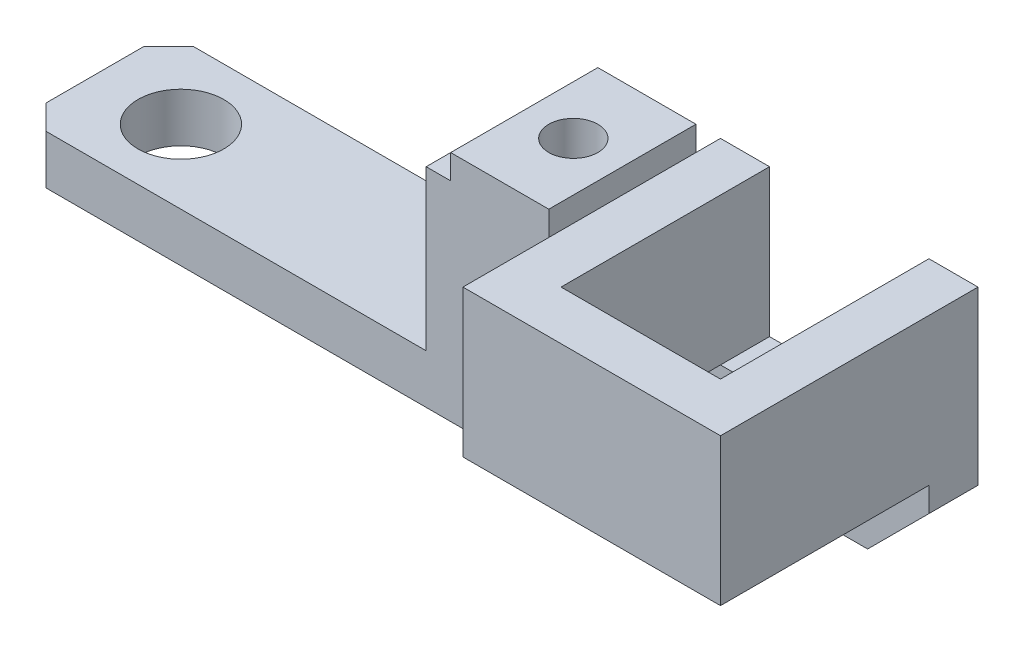
ISO-10303-21;
HEADER;
FILE_DESCRIPTION(('STEP AP214'),'2;1');
FILE_NAME('part.step','',(''),(''),'','','');
FILE_SCHEMA(('AUTOMOTIVE_DESIGN { 1 0 10303 214 1 1 1 1 }'));
ENDSEC;
DATA;
#1=APPLICATION_CONTEXT('core data for automotive mechanical design processes');
#2=APPLICATION_PROTOCOL_DEFINITION('international standard','automotive_design',2000,#1);
#3=PRODUCT_CONTEXT('',#1,'mechanical');
#4=PRODUCT('Part','Part','',(#3));
#5=PRODUCT_RELATED_PRODUCT_CATEGORY('part','',(#4));
#6=PRODUCT_DEFINITION_FORMATION('','',#4);
#7=PRODUCT_DEFINITION_CONTEXT('part definition',#1,'design');
#8=PRODUCT_DEFINITION('design','',#6,#7);
#9=PRODUCT_DEFINITION_SHAPE('','',#8);
#10=(LENGTH_UNIT() NAMED_UNIT(*) SI_UNIT(.MILLI.,.METRE.));
#11=(NAMED_UNIT(*) PLANE_ANGLE_UNIT() SI_UNIT($,.RADIAN.));
#12=(NAMED_UNIT(*) SI_UNIT($,.STERADIAN.) SOLID_ANGLE_UNIT());
#13=UNCERTAINTY_MEASURE_WITH_UNIT(LENGTH_MEASURE(1.E-05),#10,'distance_accuracy_value','');
#14=(GEOMETRIC_REPRESENTATION_CONTEXT(3) GLOBAL_UNCERTAINTY_ASSIGNED_CONTEXT((#13)) GLOBAL_UNIT_ASSIGNED_CONTEXT((#10,
#11,#12)) REPRESENTATION_CONTEXT('',''));
#15=CARTESIAN_POINT('',(0.,0.,0.));
#16=DIRECTION('',(0.,0.,1.));
#17=DIRECTION('',(1.,0.,0.));
#18=AXIS2_PLACEMENT_3D('',#15,#16,#17);
#19=CARTESIAN_POINT('',(0.,19.,0.));
#20=DIRECTION('',(0.,-1.,0.));
#21=DIRECTION('',(0.,0.,-1.));
#22=AXIS2_PLACEMENT_3D('',#19,#20,#21);
#23=PLANE('',#22);
#24=DIRECTION('',(-1.,0.,0.));
#25=VECTOR('',#24,1.);
#26=CARTESIAN_POINT('',(28.5,19.,-6.));
#27=LINE('',#26,#25);
#28=CARTESIAN_POINT('',(26.5,19.,-6.));
#29=VERTEX_POINT('',#28);
#30=CARTESIAN_POINT('',(18.5,19.,-6.));
#31=VERTEX_POINT('',#30);
#32=EDGE_CURVE('E290',#29,#31,#27,.T.);
#33=ORIENTED_EDGE('',*,*,#32,.T.);
#34=DIRECTION('',(0.,0.,1.));
#35=VECTOR('',#34,1.);
#36=CARTESIAN_POINT('',(18.5,19.,0.));
#37=LINE('',#36,#35);
#38=CARTESIAN_POINT('',(18.5,19.,6.));
#39=VERTEX_POINT('',#38);
#40=EDGE_CURVE('E267',#31,#39,#37,.T.);
#41=ORIENTED_EDGE('',*,*,#40,.T.);
#42=DIRECTION('',(-1.,0.,0.));
#43=VECTOR('',#42,1.);
#44=CARTESIAN_POINT('',(28.5,19.,6.));
#45=LINE('',#44,#43);
#46=CARTESIAN_POINT('',(26.5,19.,6.));
#47=VERTEX_POINT('',#46);
#48=EDGE_CURVE('E311',#47,#39,#45,.T.);
#49=ORIENTED_EDGE('',*,*,#48,.F.);
#50=DIRECTION('',(0.,0.,1.));
#51=VECTOR('',#50,1.);
#52=CARTESIAN_POINT('',(26.5,19.,0.));
#53=LINE('',#52,#51);
#54=EDGE_CURVE('E246',#29,#47,#53,.T.);
#55=ORIENTED_EDGE('',*,*,#54,.F.);
#56=EDGE_LOOP('',(#33,#41,#49,#55));
#57=FACE_BOUND('',#56,.T.);
#58=CARTESIAN_POINT('',(22.5,19.000012,0.));
#59=DIRECTION('',(0.,1.,0.));
#60=DIRECTION('',(0.,0.,1.));
#61=AXIS2_PLACEMENT_3D('',#58,#59,#60);
#62=CIRCLE('',#61,2.);
#63=CARTESIAN_POINT('',(22.5,19.000012,2.));
#64=VERTEX_POINT('',#63);
#65=EDGE_CURVE('E364',#64,#64,#62,.T.);
#66=ORIENTED_EDGE('',*,*,#65,.F.);
#67=EDGE_LOOP('',(#66));
#68=FACE_BOUND('',#67,.T.);
#69=ADVANCED_FACE('F51',(#57,#68),#23,.F.);
#70=CARTESIAN_POINT('',(28.5,19.,15.));
#71=DIRECTION('',(-1.,0.,0.));
#72=DIRECTION('',(0.,0.,1.));
#73=AXIS2_PLACEMENT_3D('',#70,#71,#72);
#74=PLANE('',#73);
#75=DIRECTION('',(0.,-1.,0.));
#76=VECTOR('',#75,1.);
#77=CARTESIAN_POINT('',(28.5,19.,6.));
#78=LINE('',#77,#76);
#79=CARTESIAN_POINT('',(28.5,17.,6.));
#80=VERTEX_POINT('',#79);
#81=CARTESIAN_POINT('',(28.5,7.,6.));
#82=VERTEX_POINT('',#81);
#83=EDGE_CURVE('E237',#80,#82,#78,.T.);
#84=ORIENTED_EDGE('',*,*,#83,.T.);
#85=DIRECTION('',(0.,0.,1.));
#86=VECTOR('',#85,1.);
#87=CARTESIAN_POINT('',(28.5,7.,-24.1359436211787));
#88=LINE('',#87,#86);
#89=CARTESIAN_POINT('',(28.5,7.,15.));
#90=VERTEX_POINT('',#89);
#91=EDGE_CURVE('E220',#82,#90,#88,.T.);
#92=ORIENTED_EDGE('',*,*,#91,.T.);
#93=DIRECTION('',(0.,-1.,0.));
#94=VECTOR('',#93,1.);
#95=CARTESIAN_POINT('',(28.5,19.,15.));
#96=LINE('',#95,#94);
#97=CARTESIAN_POINT('',(28.5,19.,15.));
#98=VERTEX_POINT('',#97);
#99=EDGE_CURVE('E235',#98,#90,#96,.T.);
#100=ORIENTED_EDGE('',*,*,#99,.F.);
#101=DIRECTION('',(0.,0.,-1.));
#102=VECTOR('',#101,1.);
#103=CARTESIAN_POINT('',(28.5,19.,15.));
#104=LINE('',#103,#102);
#105=CARTESIAN_POINT('',(28.5,19.,-6.));
#106=VERTEX_POINT('',#105);
#107=EDGE_CURVE('E519',#98,#106,#104,.T.);
#108=ORIENTED_EDGE('',*,*,#107,.T.);
#109=DIRECTION('',(0.,-1.,0.));
#110=VECTOR('',#109,1.);
#111=CARTESIAN_POINT('',(28.5,19.,-6.));
#112=LINE('',#111,#110);
#113=CARTESIAN_POINT('',(28.5,17.,-6.));
#114=VERTEX_POINT('',#113);
#115=EDGE_CURVE('E261',#106,#114,#112,.T.);
#116=ORIENTED_EDGE('',*,*,#115,.T.);
#117=DIRECTION('',(0.,0.,-1.));
#118=VECTOR('',#117,1.);
#119=CARTESIAN_POINT('',(28.5,17.,0.));
#120=LINE('',#119,#118);
#121=EDGE_CURVE('E301',#80,#114,#120,.T.);
#122=ORIENTED_EDGE('',*,*,#121,.F.);
#123=EDGE_LOOP('',(#84,#92,#100,#108,#116,#122));
#124=FACE_BOUND('',#123,.T.);
#125=ADVANCED_FACE('F226',(#124),#74,.T.);
#126=CARTESIAN_POINT('',(0.,4.,-6.));
#127=DIRECTION('',(0.,0.,-1.));
#128=DIRECTION('',(-1.,0.,0.));
#129=AXIS2_PLACEMENT_3D('',#126,#127,#128);
#130=PLANE('',#129);
#131=DIRECTION('',(1.,0.,0.));
#132=VECTOR('',#131,1.);
#133=CARTESIAN_POINT('',(0.,0.,-6.));
#134=LINE('',#133,#132);
#135=CARTESIAN_POINT('',(-14.5,0.,-6.));
#136=VERTEX_POINT('',#135);
#137=CARTESIAN_POINT('',(44.5,0.,-6.));
#138=VERTEX_POINT('',#137);
#139=EDGE_CURVE('E350',#136,#138,#134,.T.);
#140=ORIENTED_EDGE('',*,*,#139,.F.);
#141=DIRECTION('',(0.,1.,0.));
#142=VECTOR('',#141,1.);
#143=CARTESIAN_POINT('',(-14.5,4.,-6.));
#144=LINE('',#143,#142);
#145=CARTESIAN_POINT('',(-14.5,4.,-6.));
#146=VERTEX_POINT('',#145);
#147=EDGE_CURVE('E78',#136,#146,#144,.T.);
#148=ORIENTED_EDGE('',*,*,#147,.T.);
#149=DIRECTION('',(1.,0.,0.));
#150=VECTOR('',#149,1.);
#151=CARTESIAN_POINT('',(0.,4.,-6.));
#152=LINE('',#151,#150);
#153=CARTESIAN_POINT('',(16.5,4.,-6.));
#154=VERTEX_POINT('',#153);
#155=EDGE_CURVE('E339',#146,#154,#152,.T.);
#156=ORIENTED_EDGE('',*,*,#155,.T.);
#157=DIRECTION('',(0.,-1.,0.));
#158=VECTOR('',#157,1.);
#159=CARTESIAN_POINT('',(16.5,19.,-6.));
#160=LINE('',#159,#158);
#161=CARTESIAN_POINT('',(16.5,17.,-6.));
#162=VERTEX_POINT('',#161);
#163=EDGE_CURVE('E322',#162,#154,#160,.T.);
#164=ORIENTED_EDGE('',*,*,#163,.F.);
#165=DIRECTION('',(-1.,0.,0.));
#166=VECTOR('',#165,1.);
#167=CARTESIAN_POINT('',(0.,17.,-6.));
#168=LINE('',#167,#166);
#169=CARTESIAN_POINT('',(18.5,17.,-6.));
#170=VERTEX_POINT('',#169);
#171=EDGE_CURVE('E268',#170,#162,#168,.T.);
#172=ORIENTED_EDGE('',*,*,#171,.F.);
#173=DIRECTION('',(0.,1.,0.));
#174=VECTOR('',#173,1.);
#175=CARTESIAN_POINT('',(18.5,17.,-6.));
#176=LINE('',#175,#174);
#177=EDGE_CURVE('E276',#170,#31,#176,.T.);
#178=ORIENTED_EDGE('',*,*,#177,.T.);
#179=ORIENTED_EDGE('',*,*,#32,.F.);
#180=DIRECTION('',(0.,1.,0.));
#181=VECTOR('',#180,1.);
#182=CARTESIAN_POINT('',(26.5,17.,-6.));
#183=LINE('',#182,#181);
#184=CARTESIAN_POINT('',(26.5,17.,-6.));
#185=VERTEX_POINT('',#184);
#186=EDGE_CURVE('E302',#185,#29,#183,.T.);
#187=ORIENTED_EDGE('',*,*,#186,.F.);
#188=DIRECTION('',(-1.,0.,0.));
#189=VECTOR('',#188,1.);
#190=CARTESIAN_POINT('',(0.,17.,-6.));
#191=LINE('',#190,#189);
#192=EDGE_CURVE('E253',#114,#185,#191,.T.);
#193=ORIENTED_EDGE('',*,*,#192,.F.);
#194=ORIENTED_EDGE('',*,*,#115,.F.);
#195=DIRECTION('',(1.,0.,0.));
#196=VECTOR('',#195,1.);
#197=CARTESIAN_POINT('',(49.5,19.,-6.));
#198=LINE('',#197,#196);
#199=CARTESIAN_POINT('',(32.5,19.,-6.));
#200=VERTEX_POINT('',#199);
#201=EDGE_CURVE('E523',#106,#200,#198,.T.);
#202=ORIENTED_EDGE('',*,*,#201,.T.);
#203=DIRECTION('',(0.,1.,0.));
#204=VECTOR('',#203,1.);
#205=CARTESIAN_POINT('',(32.5,-13.6014705087355,-6.));
#206=LINE('',#205,#204);
#207=CARTESIAN_POINT('',(32.5,7.,-6.));
#208=VERTEX_POINT('',#207);
#209=EDGE_CURVE('E471',#208,#200,#206,.T.);
#210=ORIENTED_EDGE('',*,*,#209,.F.);
#211=DIRECTION('',(1.,0.,0.));
#212=VECTOR('',#211,1.);
#213=CARTESIAN_POINT('',(32.5,7.,-6.));
#214=LINE('',#213,#212);
#215=CARTESIAN_POINT('',(45.5,7.,-6.));
#216=VERTEX_POINT('',#215);
#217=EDGE_CURVE('E472',#208,#216,#214,.T.);
#218=ORIENTED_EDGE('',*,*,#217,.T.);
#219=DIRECTION('',(0.,1.,0.));
#220=VECTOR('',#219,1.);
#221=CARTESIAN_POINT('',(45.5,-13.6014705087355,-6.));
#222=LINE('',#221,#220);
#223=CARTESIAN_POINT('',(45.5,19.,-6.));
#224=VERTEX_POINT('',#223);
#225=EDGE_CURVE('E470',#216,#224,#222,.T.);
#226=ORIENTED_EDGE('',*,*,#225,.T.);
#227=CARTESIAN_POINT('',(49.5,19.,-6.));
#228=VERTEX_POINT('',#227);
#229=EDGE_CURVE('E522',#224,#228,#198,.T.);
#230=ORIENTED_EDGE('',*,*,#229,.T.);
#231=DIRECTION('',(0.,-1.,0.));
#232=VECTOR('',#231,1.);
#233=CARTESIAN_POINT('',(49.5,19.,-6.));
#234=LINE('',#233,#232);
#235=CARTESIAN_POINT('',(49.5,5.,-6.));
#236=VERTEX_POINT('',#235);
#237=EDGE_CURVE('E251',#228,#236,#234,.T.);
#238=ORIENTED_EDGE('',*,*,#237,.T.);
#239=DIRECTION('',(-0.707106781186547,-0.707106781186547,0.));
#240=VECTOR('',#239,1.);
#241=CARTESIAN_POINT('',(49.5,5.,-6.));
#242=LINE('',#241,#240);
#243=EDGE_CURVE('E510',#236,#138,#242,.T.);
#244=ORIENTED_EDGE('',*,*,#243,.T.);
#245=EDGE_LOOP('',(#140,#148,#156,#164,#172,#178,#179,#187,#193,#194,#202,#210,#218,#226,#230,
#238,#244));
#246=FACE_BOUND('',#245,.T.);
#247=ADVANCED_FACE('F399',(#246),#130,.T.);
#248=CARTESIAN_POINT('',(0.,4.,6.));
#249=DIRECTION('',(0.,0.,-1.));
#250=DIRECTION('',(-1.,0.,0.));
#251=AXIS2_PLACEMENT_3D('',#248,#249,#250);
#252=PLANE('',#251);
#253=DIRECTION('',(1.,0.,0.));
#254=VECTOR('',#253,1.);
#255=CARTESIAN_POINT('',(0.,4.,6.));
#256=LINE('',#255,#254);
#257=CARTESIAN_POINT('',(-14.5,4.,6.));
#258=VERTEX_POINT('',#257);
#259=CARTESIAN_POINT('',(16.5,4.,6.));
#260=VERTEX_POINT('',#259);
#261=EDGE_CURVE('E328',#258,#260,#256,.T.);
#262=ORIENTED_EDGE('',*,*,#261,.F.);
#263=DIRECTION('',(0.,-1.,0.));
#264=VECTOR('',#263,1.);
#265=CARTESIAN_POINT('',(-14.5,0.,6.));
#266=LINE('',#265,#264);
#267=CARTESIAN_POINT('',(-14.5,0.,6.));
#268=VERTEX_POINT('',#267);
#269=EDGE_CURVE('E12',#258,#268,#266,.T.);
#270=ORIENTED_EDGE('',*,*,#269,.T.);
#271=DIRECTION('',(1.,0.,0.));
#272=VECTOR('',#271,1.);
#273=CARTESIAN_POINT('',(0.,0.,6.));
#274=LINE('',#273,#272);
#275=CARTESIAN_POINT('',(28.5,0.,6.));
#276=VERTEX_POINT('',#275);
#277=EDGE_CURVE('E327',#268,#276,#274,.T.);
#278=ORIENTED_EDGE('',*,*,#277,.T.);
#279=EDGE_CURVE('E320',#82,#276,#78,.T.);
#280=ORIENTED_EDGE('',*,*,#279,.F.);
#281=ORIENTED_EDGE('',*,*,#83,.F.);
#282=DIRECTION('',(1.,0.,0.));
#283=VECTOR('',#282,1.);
#284=CARTESIAN_POINT('',(0.,17.,6.));
#285=LINE('',#284,#283);
#286=CARTESIAN_POINT('',(26.5,17.,6.));
#287=VERTEX_POINT('',#286);
#288=EDGE_CURVE('E297',#287,#80,#285,.T.);
#289=ORIENTED_EDGE('',*,*,#288,.F.);
#290=DIRECTION('',(0.,1.,0.));
#291=VECTOR('',#290,1.);
#292=CARTESIAN_POINT('',(26.5,17.,6.));
#293=LINE('',#292,#291);
#294=EDGE_CURVE('E282',#287,#47,#293,.T.);
#295=ORIENTED_EDGE('',*,*,#294,.T.);
#296=ORIENTED_EDGE('',*,*,#48,.T.);
#297=DIRECTION('',(0.,1.,0.));
#298=VECTOR('',#297,1.);
#299=CARTESIAN_POINT('',(18.5,17.,6.));
#300=LINE('',#299,#298);
#301=CARTESIAN_POINT('',(18.5,17.,6.));
#302=VERTEX_POINT('',#301);
#303=EDGE_CURVE('E285',#302,#39,#300,.T.);
#304=ORIENTED_EDGE('',*,*,#303,.F.);
#305=DIRECTION('',(1.,0.,0.));
#306=VECTOR('',#305,1.);
#307=CARTESIAN_POINT('',(0.,17.,6.));
#308=LINE('',#307,#306);
#309=CARTESIAN_POINT('',(16.5,17.,6.));
#310=VERTEX_POINT('',#309);
#311=EDGE_CURVE('E274',#310,#302,#308,.T.);
#312=ORIENTED_EDGE('',*,*,#311,.F.);
#313=DIRECTION('',(0.,-1.,0.));
#314=VECTOR('',#313,1.);
#315=CARTESIAN_POINT('',(16.5,19.,6.));
#316=LINE('',#315,#314);
#317=EDGE_CURVE('E319',#310,#260,#316,.T.);
#318=ORIENTED_EDGE('',*,*,#317,.T.);
#319=EDGE_LOOP('',(#262,#270,#278,#280,#281,#289,#295,#296,#304,#312,#318));
#320=FACE_BOUND('',#319,.T.);
#321=ADVANCED_FACE('F397',(#320),#252,.F.);
#322=CARTESIAN_POINT('',(-16.5,4.,0.));
#323=DIRECTION('',(-1.,0.,0.));
#324=DIRECTION('',(0.,0.,1.));
#325=AXIS2_PLACEMENT_3D('',#322,#323,#324);
#326=PLANE('',#325);
#327=DIRECTION('',(0.,0.,-1.));
#328=VECTOR('',#327,1.);
#329=CARTESIAN_POINT('',(-16.5,4.,0.));
#330=LINE('',#329,#328);
#331=CARTESIAN_POINT('',(-16.5,4.,3.99999999999999));
#332=VERTEX_POINT('',#331);
#333=CARTESIAN_POINT('',(-16.5,4.,-3.99999999999999));
#334=VERTEX_POINT('',#333);
#335=EDGE_CURVE('E336',#332,#334,#330,.T.);
#336=ORIENTED_EDGE('',*,*,#335,.T.);
#337=DIRECTION('',(0.,-1.,0.));
#338=VECTOR('',#337,1.);
#339=CARTESIAN_POINT('',(-16.5,4.,-3.99999999999999));
#340=LINE('',#339,#338);
#341=CARTESIAN_POINT('',(-16.5,0.,-3.99999999999999));
#342=VERTEX_POINT('',#341);
#343=EDGE_CURVE('E421',#334,#342,#340,.T.);
#344=ORIENTED_EDGE('',*,*,#343,.T.);
#345=DIRECTION('',(0.,0.,-1.));
#346=VECTOR('',#345,1.);
#347=CARTESIAN_POINT('',(-16.5,0.,0.));
#348=LINE('',#347,#346);
#349=CARTESIAN_POINT('',(-16.5,0.,3.99999999999999));
#350=VERTEX_POINT('',#349);
#351=EDGE_CURVE('E334',#350,#342,#348,.T.);
#352=ORIENTED_EDGE('',*,*,#351,.F.);
#353=DIRECTION('',(0.,1.,0.));
#354=VECTOR('',#353,1.);
#355=CARTESIAN_POINT('',(-16.5,4.,3.99999999999999));
#356=LINE('',#355,#354);
#357=EDGE_CURVE('E359',#350,#332,#356,.T.);
#358=ORIENTED_EDGE('',*,*,#357,.T.);
#359=EDGE_LOOP('',(#336,#344,#352,#358));
#360=FACE_BOUND('',#359,.T.);
#361=ADVANCED_FACE('F393',(#360),#326,.T.);
#362=CARTESIAN_POINT('',(0.,4.,0.));
#363=DIRECTION('',(0.,1.,0.));
#364=DIRECTION('',(0.,0.,1.));
#365=AXIS2_PLACEMENT_3D('',#362,#363,#364);
#366=PLANE('',#365);
#367=CARTESIAN_POINT('',(-9.5,4.,0.));
#368=DIRECTION('',(0.,1.,0.));
#369=DIRECTION('',(0.,0.,1.));
#370=AXIS2_PLACEMENT_3D('',#367,#368,#369);
#371=CIRCLE('',#370,3.5);
#372=CARTESIAN_POINT('',(-9.5,4.,3.5));
#373=VERTEX_POINT('',#372);
#374=EDGE_CURVE('E228',#373,#373,#371,.T.);
#375=ORIENTED_EDGE('',*,*,#374,.F.);
#376=EDGE_LOOP('',(#375));
#377=FACE_BOUND('',#376,.T.);
#378=ORIENTED_EDGE('',*,*,#155,.F.);
#379=DIRECTION('',(0.707106781186549,0.,-0.707106781186546));
#380=VECTOR('',#379,1.);
#381=CARTESIAN_POINT('',(-10.25,4.,-10.25));
#382=LINE('',#381,#380);
#383=EDGE_CURVE('E63',#146,#334,#382,.F.);
#384=ORIENTED_EDGE('',*,*,#383,.T.);
#385=ORIENTED_EDGE('',*,*,#335,.F.);
#386=DIRECTION('',(0.707106781186546,0.,0.707106781186549));
#387=VECTOR('',#386,1.);
#388=CARTESIAN_POINT('',(-10.25,4.,10.25));
#389=LINE('',#388,#387);
#390=EDGE_CURVE('E67',#332,#258,#389,.T.);
#391=ORIENTED_EDGE('',*,*,#390,.T.);
#392=ORIENTED_EDGE('',*,*,#261,.T.);
#393=DIRECTION('',(0.,0.,-1.));
#394=VECTOR('',#393,1.);
#395=CARTESIAN_POINT('',(16.5,4.,0.));
#396=LINE('',#395,#394);
#397=EDGE_CURVE('E335',#260,#154,#396,.T.);
#398=ORIENTED_EDGE('',*,*,#397,.T.);
#399=EDGE_LOOP('',(#378,#384,#385,#391,#392,#398));
#400=FACE_BOUND('',#399,.T.);
#401=ADVANCED_FACE('F389',(#377,#400),#366,.T.);
#402=CARTESIAN_POINT('',(0.,0.,0.));
#403=DIRECTION('',(0.,1.,0.));
#404=DIRECTION('',(0.,0.,1.));
#405=AXIS2_PLACEMENT_3D('',#402,#403,#404);
#406=PLANE('',#405);
#407=CARTESIAN_POINT('',(22.5,0.,0.));
#408=DIRECTION('',(0.,1.,0.));
#409=DIRECTION('',(0.,0.,1.));
#410=AXIS2_PLACEMENT_3D('',#407,#408,#409);
#411=CIRCLE('',#410,2.);
#412=CARTESIAN_POINT('',(22.5,0.,2.));
#413=VERTEX_POINT('',#412);
#414=EDGE_CURVE('E564',#413,#413,#411,.T.);
#415=ORIENTED_EDGE('',*,*,#414,.T.);
#416=EDGE_LOOP('',(#415));
#417=FACE_BOUND('',#416,.T.);
#418=CARTESIAN_POINT('',(-9.5,0.,0.));
#419=DIRECTION('',(0.,1.,0.));
#420=DIRECTION('',(0.,0.,1.));
#421=AXIS2_PLACEMENT_3D('',#418,#419,#420);
#422=CIRCLE('',#421,3.5);
#423=CARTESIAN_POINT('',(-9.5,0.,3.5));
#424=VERTEX_POINT('',#423);
#425=EDGE_CURVE('E561',#424,#424,#422,.T.);
#426=ORIENTED_EDGE('',*,*,#425,.T.);
#427=EDGE_LOOP('',(#426));
#428=FACE_BOUND('',#427,.T.);
#429=ORIENTED_EDGE('',*,*,#351,.T.);
#430=DIRECTION('',(-0.707106781186549,0.,0.707106781186546));
#431=VECTOR('',#430,1.);
#432=CARTESIAN_POINT('',(-16.5,0.,-3.99999999999999));
#433=LINE('',#432,#431);
#434=EDGE_CURVE('E429',#342,#136,#433,.F.);
#435=ORIENTED_EDGE('',*,*,#434,.T.);
#436=ORIENTED_EDGE('',*,*,#139,.T.);
#437=DIRECTION('',(0.,0.,1.));
#438=VECTOR('',#437,1.);
#439=CARTESIAN_POINT('',(44.5,0.,-6.));
#440=LINE('',#439,#438);
#441=CARTESIAN_POINT('',(44.5,0.,-2.));
#442=VERTEX_POINT('',#441);
#443=EDGE_CURVE('E514',#138,#442,#440,.T.);
#444=ORIENTED_EDGE('',*,*,#443,.T.);
#445=DIRECTION('',(-1.,0.,0.));
#446=VECTOR('',#445,1.);
#447=CARTESIAN_POINT('',(32.5,0.,-2.));
#448=LINE('',#447,#446);
#449=CARTESIAN_POINT('',(28.5,0.,-2.));
#450=VERTEX_POINT('',#449);
#451=EDGE_CURVE('E447',#442,#450,#448,.T.);
#452=ORIENTED_EDGE('',*,*,#451,.T.);
#453=DIRECTION('',(0.,0.,1.));
#454=VECTOR('',#453,1.);
#455=CARTESIAN_POINT('',(28.5,0.,-24.1359436211787));
#456=LINE('',#455,#454);
#457=EDGE_CURVE('E448',#450,#276,#456,.T.);
#458=ORIENTED_EDGE('',*,*,#457,.T.);
#459=ORIENTED_EDGE('',*,*,#277,.F.);
#460=DIRECTION('',(-0.707106781186546,0.,-0.707106781186549));
#461=VECTOR('',#460,1.);
#462=CARTESIAN_POINT('',(-14.5,0.,6.));
#463=LINE('',#462,#461);
#464=EDGE_CURVE('E433',#268,#350,#463,.T.);
#465=ORIENTED_EDGE('',*,*,#464,.T.);
#466=EDGE_LOOP('',(#429,#435,#436,#444,#452,#458,#459,#465));
#467=FACE_BOUND('',#466,.T.);
#468=ADVANCED_FACE('F387',(#417,#428,#467),#406,.F.);
#469=CARTESIAN_POINT('',(16.5,19.,6.));
#470=DIRECTION('',(-1.,0.,0.));
#471=DIRECTION('',(0.,0.,1.));
#472=AXIS2_PLACEMENT_3D('',#469,#470,#471);
#473=PLANE('',#472);
#474=DIRECTION('',(0.,0.,1.));
#475=VECTOR('',#474,1.);
#476=CARTESIAN_POINT('',(16.5,17.,0.));
#477=LINE('',#476,#475);
#478=EDGE_CURVE('E275',#162,#310,#477,.T.);
#479=ORIENTED_EDGE('',*,*,#478,.F.);
#480=ORIENTED_EDGE('',*,*,#163,.T.);
#481=ORIENTED_EDGE('',*,*,#397,.F.);
#482=ORIENTED_EDGE('',*,*,#317,.F.);
#483=EDGE_LOOP('',(#479,#480,#481,#482));
#484=FACE_BOUND('',#483,.T.);
#485=ADVANCED_FACE('F382',(#484),#473,.T.);
#486=CARTESIAN_POINT('',(26.5,17.,0.));
#487=DIRECTION('',(-1.,0.,0.));
#488=DIRECTION('',(0.,0.,1.));
#489=AXIS2_PLACEMENT_3D('',#486,#487,#488);
#490=PLANE('',#489);
#491=ORIENTED_EDGE('',*,*,#54,.T.);
#492=ORIENTED_EDGE('',*,*,#294,.F.);
#493=DIRECTION('',(0.,0.,1.));
#494=VECTOR('',#493,1.);
#495=CARTESIAN_POINT('',(26.5,17.,0.));
#496=LINE('',#495,#494);
#497=EDGE_CURVE('E294',#185,#287,#496,.T.);
#498=ORIENTED_EDGE('',*,*,#497,.F.);
#499=ORIENTED_EDGE('',*,*,#186,.T.);
#500=EDGE_LOOP('',(#491,#492,#498,#499));
#501=FACE_BOUND('',#500,.T.);
#502=ADVANCED_FACE('F381',(#501),#490,.F.);
#503=CARTESIAN_POINT('',(0.,17.,0.));
#504=DIRECTION('',(0.,1.,0.));
#505=DIRECTION('',(0.,0.,1.));
#506=AXIS2_PLACEMENT_3D('',#503,#504,#505);
#507=PLANE('',#506);
#508=ORIENTED_EDGE('',*,*,#192,.T.);
#509=ORIENTED_EDGE('',*,*,#497,.T.);
#510=ORIENTED_EDGE('',*,*,#288,.T.);
#511=ORIENTED_EDGE('',*,*,#121,.T.);
#512=EDGE_LOOP('',(#508,#509,#510,#511));
#513=FACE_BOUND('',#512,.T.);
#514=ADVANCED_FACE('F546',(#513),#507,.T.);
#515=CARTESIAN_POINT('',(18.5,17.,0.));
#516=DIRECTION('',(-1.,0.,0.));
#517=DIRECTION('',(0.,0.,1.));
#518=AXIS2_PLACEMENT_3D('',#515,#516,#517);
#519=PLANE('',#518);
#520=ORIENTED_EDGE('',*,*,#40,.F.);
#521=ORIENTED_EDGE('',*,*,#177,.F.);
#522=DIRECTION('',(0.,0.,1.));
#523=VECTOR('',#522,1.);
#524=CARTESIAN_POINT('',(18.5,17.,0.));
#525=LINE('',#524,#523);
#526=EDGE_CURVE('E264',#170,#302,#525,.T.);
#527=ORIENTED_EDGE('',*,*,#526,.T.);
#528=ORIENTED_EDGE('',*,*,#303,.T.);
#529=EDGE_LOOP('',(#520,#521,#527,#528));
#530=FACE_BOUND('',#529,.T.);
#531=ADVANCED_FACE('F618',(#530),#519,.T.);
#532=CARTESIAN_POINT('',(0.,17.,0.));
#533=DIRECTION('',(0.,1.,0.));
#534=DIRECTION('',(0.,0.,1.));
#535=AXIS2_PLACEMENT_3D('',#532,#533,#534);
#536=PLANE('',#535);
#537=ORIENTED_EDGE('',*,*,#526,.F.);
#538=ORIENTED_EDGE('',*,*,#171,.T.);
#539=ORIENTED_EDGE('',*,*,#478,.T.);
#540=ORIENTED_EDGE('',*,*,#311,.T.);
#541=EDGE_LOOP('',(#537,#538,#539,#540));
#542=FACE_BOUND('',#541,.T.);
#543=ADVANCED_FACE('F614',(#542),#536,.T.);
#544=CARTESIAN_POINT('',(49.5,19.,15.));
#545=DIRECTION('',(0.,0.,1.));
#546=DIRECTION('',(1.,0.,0.));
#547=AXIS2_PLACEMENT_3D('',#544,#545,#546);
#548=PLANE('',#547);
#549=DIRECTION('',(-1.,0.,0.));
#550=VECTOR('',#549,1.);
#551=CARTESIAN_POINT('',(28.5,7.,15.));
#552=LINE('',#551,#550);
#553=CARTESIAN_POINT('',(49.5,7.,15.));
#554=VERTEX_POINT('',#553);
#555=EDGE_CURVE('E215',#554,#90,#552,.T.);
#556=ORIENTED_EDGE('',*,*,#555,.F.);
#557=DIRECTION('',(0.,-1.,0.));
#558=VECTOR('',#557,1.);
#559=CARTESIAN_POINT('',(49.5,19.,15.));
#560=LINE('',#559,#558);
#561=CARTESIAN_POINT('',(49.5,19.,15.));
#562=VERTEX_POINT('',#561);
#563=EDGE_CURVE('E250',#562,#554,#560,.T.);
#564=ORIENTED_EDGE('',*,*,#563,.F.);
#565=DIRECTION('',(-1.,0.,0.));
#566=VECTOR('',#565,1.);
#567=CARTESIAN_POINT('',(49.5,19.,15.));
#568=LINE('',#567,#566);
#569=EDGE_CURVE('E245',#562,#98,#568,.T.);
#570=ORIENTED_EDGE('',*,*,#569,.T.);
#571=ORIENTED_EDGE('',*,*,#99,.T.);
#572=EDGE_LOOP('',(#556,#564,#570,#571));
#573=FACE_BOUND('',#572,.T.);
#574=ADVANCED_FACE('F244',(#573),#548,.T.);
#575=CARTESIAN_POINT('',(49.5,19.,15.));
#576=DIRECTION('',(1.,0.,0.));
#577=DIRECTION('',(0.,0.,-1.));
#578=AXIS2_PLACEMENT_3D('',#575,#576,#577);
#579=PLANE('',#578);
#580=DIRECTION('',(0.,1.,0.));
#581=VECTOR('',#580,1.);
#582=CARTESIAN_POINT('',(49.5,0.,-2.));
#583=LINE('',#582,#581);
#584=CARTESIAN_POINT('',(49.5,5.,-2.));
#585=VERTEX_POINT('',#584);
#586=CARTESIAN_POINT('',(49.5,7.,-2.));
#587=VERTEX_POINT('',#586);
#588=EDGE_CURVE('E223',#585,#587,#583,.T.);
#589=ORIENTED_EDGE('',*,*,#588,.F.);
#590=DIRECTION('',(0.,0.,1.));
#591=VECTOR('',#590,1.);
#592=CARTESIAN_POINT('',(49.5,5.,-6.));
#593=LINE('',#592,#591);
#594=EDGE_CURVE('E511',#236,#585,#593,.T.);
#595=ORIENTED_EDGE('',*,*,#594,.F.);
#596=ORIENTED_EDGE('',*,*,#237,.F.);
#597=DIRECTION('',(0.,0.,1.));
#598=VECTOR('',#597,1.);
#599=CARTESIAN_POINT('',(49.5,19.,15.));
#600=LINE('',#599,#598);
#601=EDGE_CURVE('E527',#228,#562,#600,.T.);
#602=ORIENTED_EDGE('',*,*,#601,.T.);
#603=ORIENTED_EDGE('',*,*,#563,.T.);
#604=DIRECTION('',(0.,0.,1.));
#605=VECTOR('',#604,1.);
#606=CARTESIAN_POINT('',(49.5,7.,-24.1359436211787));
#607=LINE('',#606,#605);
#608=EDGE_CURVE('E219',#587,#554,#607,.T.);
#609=ORIENTED_EDGE('',*,*,#608,.F.);
#610=EDGE_LOOP('',(#589,#595,#596,#602,#603,#609));
#611=FACE_BOUND('',#610,.T.);
#612=ADVANCED_FACE('F532',(#611),#579,.T.);
#613=CARTESIAN_POINT('',(0.,19.,0.));
#614=DIRECTION('',(0.,1.,0.));
#615=DIRECTION('',(0.,0.,1.));
#616=AXIS2_PLACEMENT_3D('',#613,#614,#615);
#617=PLANE('',#616);
#618=DIRECTION('',(0.,0.,1.));
#619=VECTOR('',#618,1.);
#620=CARTESIAN_POINT('',(32.5,19.,-2.));
#621=LINE('',#620,#619);
#622=CARTESIAN_POINT('',(32.5,19.,11.));
#623=VERTEX_POINT('',#622);
#624=EDGE_CURVE('E500',#200,#623,#621,.T.);
#625=ORIENTED_EDGE('',*,*,#624,.F.);
#626=ORIENTED_EDGE('',*,*,#201,.F.);
#627=ORIENTED_EDGE('',*,*,#107,.F.);
#628=ORIENTED_EDGE('',*,*,#569,.F.);
#629=ORIENTED_EDGE('',*,*,#601,.F.);
#630=ORIENTED_EDGE('',*,*,#229,.F.);
#631=DIRECTION('',(0.,0.,-1.));
#632=VECTOR('',#631,1.);
#633=CARTESIAN_POINT('',(45.5,19.,-2.));
#634=LINE('',#633,#632);
#635=CARTESIAN_POINT('',(45.5,19.,11.));
#636=VERTEX_POINT('',#635);
#637=EDGE_CURVE('E489',#636,#224,#634,.T.);
#638=ORIENTED_EDGE('',*,*,#637,.F.);
#639=DIRECTION('',(1.,0.,0.));
#640=VECTOR('',#639,1.);
#641=CARTESIAN_POINT('',(32.5,19.,11.));
#642=LINE('',#641,#640);
#643=EDGE_CURVE('E493',#623,#636,#642,.T.);
#644=ORIENTED_EDGE('',*,*,#643,.F.);
#645=EDGE_LOOP('',(#625,#626,#627,#628,#629,#630,#638,#644));
#646=FACE_BOUND('',#645,.T.);
#647=ADVANCED_FACE('F537',(#646),#617,.T.);
#648=CARTESIAN_POINT('',(49.5,5.,-6.));
#649=DIRECTION('',(-0.707106781186547,0.707106781186547,0.));
#650=DIRECTION('',(-0.707106781186548,-0.707106781186548,0.));
#651=AXIS2_PLACEMENT_3D('',#648,#649,#650);
#652=PLANE('',#651);
#653=ORIENTED_EDGE('',*,*,#594,.T.);
#654=DIRECTION('',(-0.707106781186548,-0.707106781186548,0.));
#655=VECTOR('',#654,1.);
#656=CARTESIAN_POINT('',(49.5,5.,-2.));
#657=LINE('',#656,#655);
#658=EDGE_CURVE('E343',#585,#442,#657,.T.);
#659=ORIENTED_EDGE('',*,*,#658,.T.);
#660=ORIENTED_EDGE('',*,*,#443,.F.);
#661=ORIENTED_EDGE('',*,*,#243,.F.);
#662=EDGE_LOOP('',(#653,#659,#660,#661));
#663=FACE_BOUND('',#662,.T.);
#664=ADVANCED_FACE('F602',(#663),#652,.F.);
#665=CARTESIAN_POINT('',(45.5,0.,-2.));
#666=DIRECTION('',(1.,0.,0.));
#667=DIRECTION('',(0.,0.,-1.));
#668=AXIS2_PLACEMENT_3D('',#665,#666,#667);
#669=PLANE('',#668);
#670=DIRECTION('',(0.,0.,1.));
#671=VECTOR('',#670,1.);
#672=CARTESIAN_POINT('',(45.5,7.,-2.));
#673=LINE('',#672,#671);
#674=CARTESIAN_POINT('',(45.5,7.,-2.));
#675=VERTEX_POINT('',#674);
#676=EDGE_CURVE('E467',#216,#675,#673,.T.);
#677=ORIENTED_EDGE('',*,*,#676,.T.);
#678=DIRECTION('',(0.,0.,1.));
#679=VECTOR('',#678,1.);
#680=CARTESIAN_POINT('',(45.5,7.,-2.));
#681=LINE('',#680,#679);
#682=CARTESIAN_POINT('',(45.5,7.,11.));
#683=VERTEX_POINT('',#682);
#684=EDGE_CURVE('E459',#675,#683,#681,.T.);
#685=ORIENTED_EDGE('',*,*,#684,.T.);
#686=DIRECTION('',(0.,1.,0.));
#687=VECTOR('',#686,1.);
#688=CARTESIAN_POINT('',(45.5,0.,11.));
#689=LINE('',#688,#687);
#690=EDGE_CURVE('E505',#683,#636,#689,.T.);
#691=ORIENTED_EDGE('',*,*,#690,.T.);
#692=ORIENTED_EDGE('',*,*,#637,.T.);
#693=ORIENTED_EDGE('',*,*,#225,.F.);
#694=EDGE_LOOP('',(#677,#685,#691,#692,#693));
#695=FACE_BOUND('',#694,.T.);
#696=ADVANCED_FACE('F593',(#695),#669,.F.);
#697=CARTESIAN_POINT('',(32.5,0.,11.));
#698=DIRECTION('',(0.,0.,1.));
#699=DIRECTION('',(1.,0.,0.));
#700=AXIS2_PLACEMENT_3D('',#697,#698,#699);
#701=PLANE('',#700);
#702=ORIENTED_EDGE('',*,*,#690,.F.);
#703=DIRECTION('',(-1.,0.,0.));
#704=VECTOR('',#703,1.);
#705=CARTESIAN_POINT('',(32.5,7.,11.));
#706=LINE('',#705,#704);
#707=CARTESIAN_POINT('',(32.5,7.,11.));
#708=VERTEX_POINT('',#707);
#709=EDGE_CURVE('E452',#683,#708,#706,.T.);
#710=ORIENTED_EDGE('',*,*,#709,.T.);
#711=DIRECTION('',(0.,1.,0.));
#712=VECTOR('',#711,1.);
#713=CARTESIAN_POINT('',(32.5,0.,11.));
#714=LINE('',#713,#712);
#715=EDGE_CURVE('E492',#708,#623,#714,.T.);
#716=ORIENTED_EDGE('',*,*,#715,.T.);
#717=ORIENTED_EDGE('',*,*,#643,.T.);
#718=EDGE_LOOP('',(#702,#710,#716,#717));
#719=FACE_BOUND('',#718,.T.);
#720=ADVANCED_FACE('F589',(#719),#701,.F.);
#721=CARTESIAN_POINT('',(32.5,0.,-2.));
#722=DIRECTION('',(0.,0.,-1.));
#723=DIRECTION('',(-1.,0.,0.));
#724=AXIS2_PLACEMENT_3D('',#721,#722,#723);
#725=PLANE('',#724);
#726=ORIENTED_EDGE('',*,*,#658,.F.);
#727=ORIENTED_EDGE('',*,*,#588,.T.);
#728=DIRECTION('',(-1.,0.,0.));
#729=VECTOR('',#728,1.);
#730=CARTESIAN_POINT('',(28.5,7.,-2.));
#731=LINE('',#730,#729);
#732=EDGE_CURVE('E239',#587,#675,#731,.T.);
#733=ORIENTED_EDGE('',*,*,#732,.T.);
#734=DIRECTION('',(-1.,0.,0.));
#735=VECTOR('',#734,1.);
#736=CARTESIAN_POINT('',(32.5,7.,-2.));
#737=LINE('',#736,#735);
#738=CARTESIAN_POINT('',(32.5,7.,-2.));
#739=VERTEX_POINT('',#738);
#740=EDGE_CURVE('E477',#675,#739,#737,.T.);
#741=ORIENTED_EDGE('',*,*,#740,.T.);
#742=CARTESIAN_POINT('',(28.5,7.,-2.));
#743=VERTEX_POINT('',#742);
#744=EDGE_CURVE('E558',#739,#743,#731,.T.);
#745=ORIENTED_EDGE('',*,*,#744,.T.);
#746=DIRECTION('',(0.,-1.,0.));
#747=VECTOR('',#746,1.);
#748=CARTESIAN_POINT('',(28.5,0.,-2.));
#749=LINE('',#748,#747);
#750=EDGE_CURVE('E453',#743,#450,#749,.T.);
#751=ORIENTED_EDGE('',*,*,#750,.T.);
#752=ORIENTED_EDGE('',*,*,#451,.F.);
#753=EDGE_LOOP('',(#726,#727,#733,#741,#745,#751,#752));
#754=FACE_BOUND('',#753,.T.);
#755=ADVANCED_FACE('F595',(#754),#725,.F.);
#756=CARTESIAN_POINT('',(32.5,0.,-2.));
#757=DIRECTION('',(-1.,0.,0.));
#758=DIRECTION('',(0.,0.,1.));
#759=AXIS2_PLACEMENT_3D('',#756,#757,#758);
#760=PLANE('',#759);
#761=ORIENTED_EDGE('',*,*,#715,.F.);
#762=DIRECTION('',(0.,0.,-1.));
#763=VECTOR('',#762,1.);
#764=CARTESIAN_POINT('',(32.5,7.,-2.));
#765=LINE('',#764,#763);
#766=EDGE_CURVE('E356',#708,#739,#765,.T.);
#767=ORIENTED_EDGE('',*,*,#766,.T.);
#768=DIRECTION('',(0.,0.,-1.));
#769=VECTOR('',#768,1.);
#770=CARTESIAN_POINT('',(32.5,7.,-2.));
#771=LINE('',#770,#769);
#772=EDGE_CURVE('E480',#739,#208,#771,.T.);
#773=ORIENTED_EDGE('',*,*,#772,.T.);
#774=ORIENTED_EDGE('',*,*,#209,.T.);
#775=ORIENTED_EDGE('',*,*,#624,.T.);
#776=EDGE_LOOP('',(#761,#767,#773,#774,#775));
#777=FACE_BOUND('',#776,.T.);
#778=ADVANCED_FACE('F590',(#777),#760,.F.);
#779=CARTESIAN_POINT('',(0.,7.,0.));
#780=DIRECTION('',(0.,1.,0.));
#781=DIRECTION('',(0.,0.,1.));
#782=AXIS2_PLACEMENT_3D('',#779,#780,#781);
#783=PLANE('',#782);
#784=ORIENTED_EDGE('',*,*,#772,.F.);
#785=ORIENTED_EDGE('',*,*,#740,.F.);
#786=ORIENTED_EDGE('',*,*,#676,.F.);
#787=ORIENTED_EDGE('',*,*,#217,.F.);
#788=EDGE_LOOP('',(#784,#785,#786,#787));
#789=FACE_BOUND('',#788,.T.);
#790=ADVANCED_FACE('F585',(#789),#783,.T.);
#791=CARTESIAN_POINT('',(28.5,7.,-24.1359436211787));
#792=DIRECTION('',(0.,1.,0.));
#793=DIRECTION('',(0.,0.,1.));
#794=AXIS2_PLACEMENT_3D('',#791,#792,#793);
#795=PLANE('',#794);
#796=ORIENTED_EDGE('',*,*,#732,.F.);
#797=ORIENTED_EDGE('',*,*,#608,.T.);
#798=ORIENTED_EDGE('',*,*,#555,.T.);
#799=ORIENTED_EDGE('',*,*,#91,.F.);
#800=EDGE_CURVE('E236',#743,#82,#88,.T.);
#801=ORIENTED_EDGE('',*,*,#800,.F.);
#802=ORIENTED_EDGE('',*,*,#744,.F.);
#803=ORIENTED_EDGE('',*,*,#766,.F.);
#804=ORIENTED_EDGE('',*,*,#709,.F.);
#805=ORIENTED_EDGE('',*,*,#684,.F.);
#806=EDGE_LOOP('',(#796,#797,#798,#799,#801,#802,#803,#804,#805));
#807=FACE_BOUND('',#806,.T.);
#808=ADVANCED_FACE('F214',(#807),#795,.F.);
#809=CARTESIAN_POINT('',(28.5,0.,-24.1359436211787));
#810=DIRECTION('',(-1.,0.,0.));
#811=DIRECTION('',(0.,0.,1.));
#812=AXIS2_PLACEMENT_3D('',#809,#810,#811);
#813=PLANE('',#812);
#814=ORIENTED_EDGE('',*,*,#279,.T.);
#815=ORIENTED_EDGE('',*,*,#457,.F.);
#816=ORIENTED_EDGE('',*,*,#750,.F.);
#817=ORIENTED_EDGE('',*,*,#800,.T.);
#818=EDGE_LOOP('',(#814,#815,#816,#817));
#819=FACE_BOUND('',#818,.T.);
#820=ADVANCED_FACE('F548',(#819),#813,.F.);
#821=CARTESIAN_POINT('',(-9.5,0.,0.));
#822=DIRECTION('',(0.,1.,0.));
#823=DIRECTION('',(0.,0.,1.));
#824=AXIS2_PLACEMENT_3D('',#821,#822,#823);
#825=CYLINDRICAL_SURFACE('',#824,3.5);
#826=ORIENTED_EDGE('',*,*,#374,.T.);
#827=EDGE_LOOP('',(#826));
#828=FACE_BOUND('',#827,.T.);
#829=ORIENTED_EDGE('',*,*,#425,.F.);
#830=EDGE_LOOP('',(#829));
#831=FACE_BOUND('',#830,.T.);
#832=ADVANCED_FACE('F417',(#828,#831),#825,.F.);
#833=CARTESIAN_POINT('',(22.5,0.,0.));
#834=DIRECTION('',(0.,1.,0.));
#835=DIRECTION('',(0.,0.,1.));
#836=AXIS2_PLACEMENT_3D('',#833,#834,#835);
#837=CYLINDRICAL_SURFACE('',#836,2.);
#838=ORIENTED_EDGE('',*,*,#414,.F.);
#839=EDGE_LOOP('',(#838));
#840=FACE_BOUND('',#839,.T.);
#841=ORIENTED_EDGE('',*,*,#65,.T.);
#842=EDGE_LOOP('',(#841));
#843=FACE_BOUND('',#842,.T.);
#844=ADVANCED_FACE('F406',(#840,#843),#837,.F.);
#845=CARTESIAN_POINT('',(-16.5,4.,-3.99999999999999));
#846=DIRECTION('',(0.707106781186546,0.,0.707106781186549));
#847=DIRECTION('',(0.,-1.,0.));
#848=AXIS2_PLACEMENT_3D('',#845,#846,#847);
#849=PLANE('',#848);
#850=ORIENTED_EDGE('',*,*,#383,.F.);
#851=ORIENTED_EDGE('',*,*,#147,.F.);
#852=ORIENTED_EDGE('',*,*,#434,.F.);
#853=ORIENTED_EDGE('',*,*,#343,.F.);
#854=EDGE_LOOP('',(#850,#851,#852,#853));
#855=FACE_BOUND('',#854,.T.);
#856=ADVANCED_FACE('F408',(#855),#849,.F.);
#857=CARTESIAN_POINT('',(-14.5,4.,6.));
#858=DIRECTION('',(-0.707106781186549,0.,0.707106781186546));
#859=DIRECTION('',(0.,1.,0.));
#860=AXIS2_PLACEMENT_3D('',#857,#858,#859);
#861=PLANE('',#860);
#862=ORIENTED_EDGE('',*,*,#390,.F.);
#863=ORIENTED_EDGE('',*,*,#357,.F.);
#864=ORIENTED_EDGE('',*,*,#464,.F.);
#865=ORIENTED_EDGE('',*,*,#269,.F.);
#866=EDGE_LOOP('',(#862,#863,#864,#865));
#867=FACE_BOUND('',#866,.T.);
#868=ADVANCED_FACE('F53',(#867),#861,.T.);
#869=CLOSED_SHELL('',(#69,#125,#247,#321,#361,#401,#468,#485,#502,#514,#531,#543,#574,#612,#647,
#664,#696,#720,#755,#778,#790,#808,#820,#832,#844,#856,#868));
#870=MANIFOLD_SOLID_BREP('B2',#869);
#871=ADVANCED_BREP_SHAPE_REPRESENTATION('',(#18,#870),#14);
#872=SHAPE_DEFINITION_REPRESENTATION(#9,#871);
ENDSEC;
END-ISO-10303-21;
